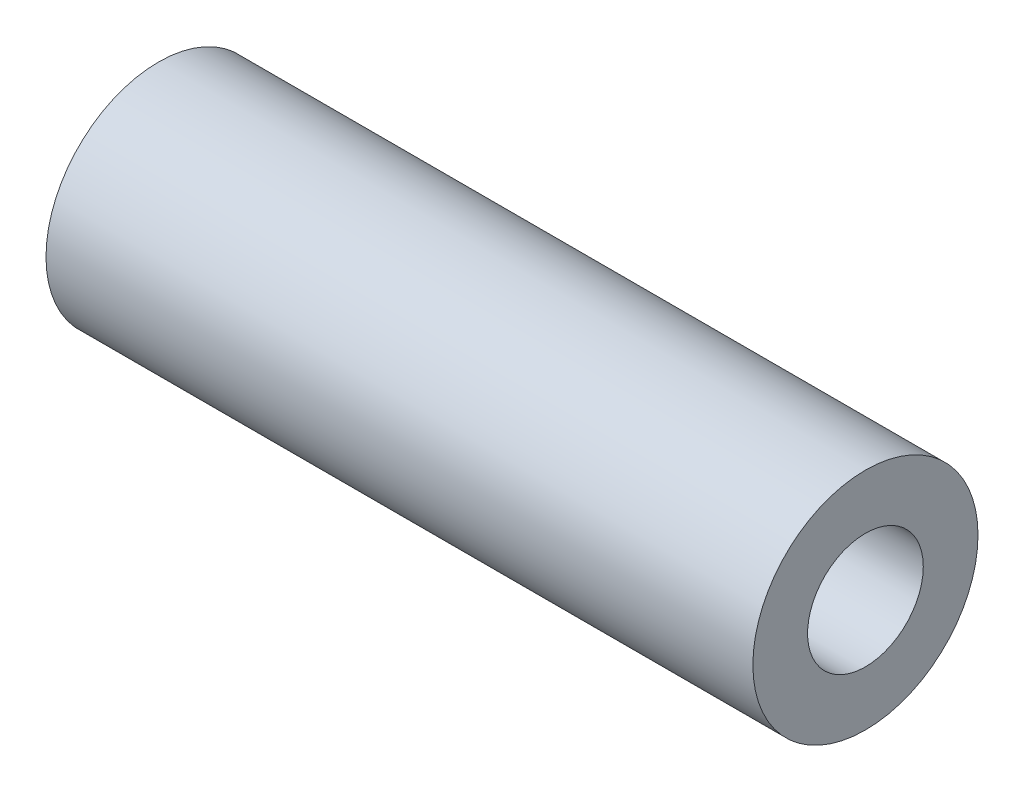
ISO-10303-21;
HEADER;
FILE_DESCRIPTION(('STEP AP214'),'2;1');
FILE_NAME('part.step','',(''),(''),'','','');
FILE_SCHEMA(('AUTOMOTIVE_DESIGN { 1 0 10303 214 1 1 1 1 }'));
ENDSEC;
DATA;
#1=APPLICATION_CONTEXT('core data for automotive mechanical design processes');
#2=APPLICATION_PROTOCOL_DEFINITION('international standard','automotive_design',2000,#1);
#3=PRODUCT_CONTEXT('',#1,'mechanical');
#4=PRODUCT('Part','Part','',(#3));
#5=PRODUCT_RELATED_PRODUCT_CATEGORY('part','',(#4));
#6=PRODUCT_DEFINITION_FORMATION('','',#4);
#7=PRODUCT_DEFINITION_CONTEXT('part definition',#1,'design');
#8=PRODUCT_DEFINITION('design','',#6,#7);
#9=PRODUCT_DEFINITION_SHAPE('','',#8);
#10=(LENGTH_UNIT() NAMED_UNIT(*) SI_UNIT(.MILLI.,.METRE.));
#11=(NAMED_UNIT(*) PLANE_ANGLE_UNIT() SI_UNIT($,.RADIAN.));
#12=(NAMED_UNIT(*) SI_UNIT($,.STERADIAN.) SOLID_ANGLE_UNIT());
#13=UNCERTAINTY_MEASURE_WITH_UNIT(LENGTH_MEASURE(1.E-05),#10,'distance_accuracy_value','');
#14=(GEOMETRIC_REPRESENTATION_CONTEXT(3) GLOBAL_UNCERTAINTY_ASSIGNED_CONTEXT((#13)) GLOBAL_UNIT_ASSIGNED_CONTEXT((#10,
#11,#12)) REPRESENTATION_CONTEXT('',''));
#15=CARTESIAN_POINT('',(0.,0.,0.));
#16=DIRECTION('',(0.,0.,1.));
#17=DIRECTION('',(1.,0.,0.));
#18=AXIS2_PLACEMENT_3D('',#15,#16,#17);
#19=CARTESIAN_POINT('',(39.878,0.,0.));
#20=DIRECTION('',(1.,0.,0.));
#21=DIRECTION('',(0.,0.,-1.));
#22=AXIS2_PLACEMENT_3D('',#19,#20,#21);
#23=PLANE('',#22);
#24=CARTESIAN_POINT('',(39.878,0.,0.));
#25=DIRECTION('',(1.,0.,0.));
#26=DIRECTION('',(0.,0.,-1.));
#27=AXIS2_PLACEMENT_3D('',#24,#25,#26);
#28=CIRCLE('',#27,6.35);
#29=CARTESIAN_POINT('',(39.878,0.,-6.35));
#30=VERTEX_POINT('',#29);
#31=EDGE_CURVE('E10',#30,#30,#28,.T.);
#32=ORIENTED_EDGE('',*,*,#31,.T.);
#33=EDGE_LOOP('',(#32));
#34=FACE_BOUND('',#33,.T.);
#35=CARTESIAN_POINT('',(39.878,0.,0.));
#36=DIRECTION('',(1.,0.,0.));
#37=DIRECTION('',(0.,0.,-1.));
#38=AXIS2_PLACEMENT_3D('',#35,#36,#37);
#39=CIRCLE('',#38,3.2639);
#40=CARTESIAN_POINT('',(39.878,0.,-3.2639));
#41=VERTEX_POINT('',#40);
#42=EDGE_CURVE('E41',#41,#41,#39,.T.);
#43=ORIENTED_EDGE('',*,*,#42,.F.);
#44=EDGE_LOOP('',(#43));
#45=FACE_BOUND('',#44,.T.);
#46=ADVANCED_FACE('F30',(#34,#45),#23,.T.);
#47=CARTESIAN_POINT('',(0.,0.,0.));
#48=DIRECTION('',(1.,0.,0.));
#49=DIRECTION('',(0.,0.,-1.));
#50=AXIS2_PLACEMENT_3D('',#47,#48,#49);
#51=PLANE('',#50);
#52=CARTESIAN_POINT('',(0.,0.,0.));
#53=DIRECTION('',(1.,0.,0.));
#54=DIRECTION('',(0.,0.,-1.));
#55=AXIS2_PLACEMENT_3D('',#52,#53,#54);
#56=CIRCLE('',#55,6.35);
#57=CARTESIAN_POINT('',(0.,0.,-6.35));
#58=VERTEX_POINT('',#57);
#59=EDGE_CURVE('E34',#58,#58,#56,.T.);
#60=ORIENTED_EDGE('',*,*,#59,.F.);
#61=EDGE_LOOP('',(#60));
#62=FACE_BOUND('',#61,.T.);
#63=CARTESIAN_POINT('',(0.,0.,0.));
#64=DIRECTION('',(1.,0.,0.));
#65=DIRECTION('',(0.,0.,-1.));
#66=AXIS2_PLACEMENT_3D('',#63,#64,#65);
#67=CIRCLE('',#66,3.2639);
#68=CARTESIAN_POINT('',(0.,0.,-3.2639));
#69=VERTEX_POINT('',#68);
#70=EDGE_CURVE('E43',#69,#69,#67,.T.);
#71=ORIENTED_EDGE('',*,*,#70,.T.);
#72=EDGE_LOOP('',(#71));
#73=FACE_BOUND('',#72,.T.);
#74=ADVANCED_FACE('F53',(#62,#73),#51,.F.);
#75=CARTESIAN_POINT('',(39.878,0.,0.));
#76=DIRECTION('',(-1.,0.,0.));
#77=DIRECTION('',(0.,0.,1.));
#78=AXIS2_PLACEMENT_3D('',#75,#76,#77);
#79=CYLINDRICAL_SURFACE('',#78,6.35);
#80=ORIENTED_EDGE('',*,*,#31,.F.);
#81=EDGE_LOOP('',(#80));
#82=FACE_BOUND('',#81,.T.);
#83=ORIENTED_EDGE('',*,*,#59,.T.);
#84=EDGE_LOOP('',(#83));
#85=FACE_BOUND('',#84,.T.);
#86=ADVANCED_FACE('F32',(#82,#85),#79,.T.);
#87=CARTESIAN_POINT('',(39.878,0.,0.));
#88=DIRECTION('',(-1.,0.,0.));
#89=DIRECTION('',(0.,0.,1.));
#90=AXIS2_PLACEMENT_3D('',#87,#88,#89);
#91=CYLINDRICAL_SURFACE('',#90,3.2639);
#92=ORIENTED_EDGE('',*,*,#42,.T.);
#93=EDGE_LOOP('',(#92));
#94=FACE_BOUND('',#93,.T.);
#95=ORIENTED_EDGE('',*,*,#70,.F.);
#96=EDGE_LOOP('',(#95));
#97=FACE_BOUND('',#96,.T.);
#98=ADVANCED_FACE('F49',(#94,#97),#91,.F.);
#99=CLOSED_SHELL('',(#46,#74,#86,#98));
#100=MANIFOLD_SOLID_BREP('B2',#99);
#101=ADVANCED_BREP_SHAPE_REPRESENTATION('',(#18,#100),#14);
#102=SHAPE_DEFINITION_REPRESENTATION(#9,#101);
ENDSEC;
END-ISO-10303-21;
